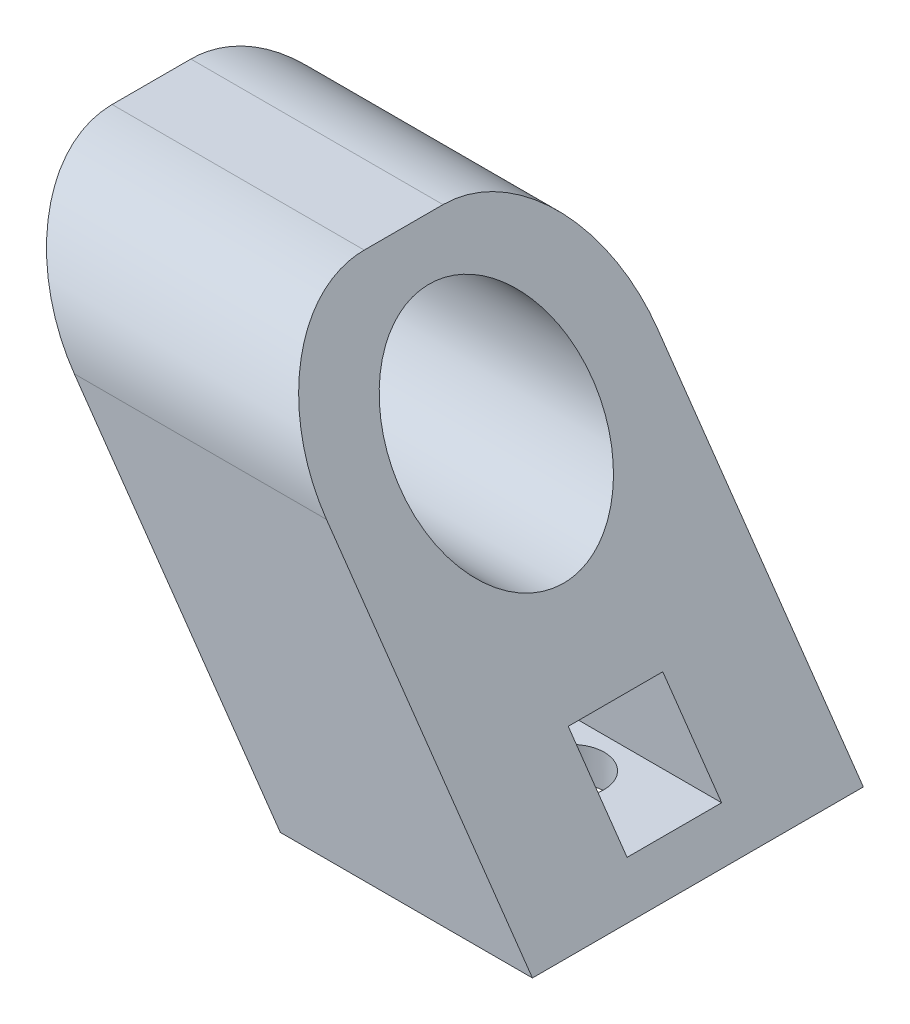
ISO-10303-21;
HEADER;
FILE_DESCRIPTION(('STEP AP214'),'2;1');
FILE_NAME('part.step','',(''),(''),'','','');
FILE_SCHEMA(('AUTOMOTIVE_DESIGN { 1 0 10303 214 1 1 1 1 }'));
ENDSEC;
DATA;
#1=APPLICATION_CONTEXT('core data for automotive mechanical design processes');
#2=APPLICATION_PROTOCOL_DEFINITION('international standard','automotive_design',2000,#1);
#3=PRODUCT_CONTEXT('',#1,'mechanical');
#4=PRODUCT('Part','Part','',(#3));
#5=PRODUCT_RELATED_PRODUCT_CATEGORY('part','',(#4));
#6=PRODUCT_DEFINITION_FORMATION('','',#4);
#7=PRODUCT_DEFINITION_CONTEXT('part definition',#1,'design');
#8=PRODUCT_DEFINITION('design','',#6,#7);
#9=PRODUCT_DEFINITION_SHAPE('','',#8);
#10=(LENGTH_UNIT() NAMED_UNIT(*) SI_UNIT(.MILLI.,.METRE.));
#11=(NAMED_UNIT(*) PLANE_ANGLE_UNIT() SI_UNIT($,.RADIAN.));
#12=(NAMED_UNIT(*) SI_UNIT($,.STERADIAN.) SOLID_ANGLE_UNIT());
#13=UNCERTAINTY_MEASURE_WITH_UNIT(LENGTH_MEASURE(1.E-05),#10,'distance_accuracy_value','');
#14=(GEOMETRIC_REPRESENTATION_CONTEXT(3) GLOBAL_UNCERTAINTY_ASSIGNED_CONTEXT((#13)) GLOBAL_UNIT_ASSIGNED_CONTEXT((#10,
#11,#12)) REPRESENTATION_CONTEXT('',''));
#15=CARTESIAN_POINT('',(0.,0.,0.));
#16=DIRECTION('',(0.,0.,1.));
#17=DIRECTION('',(1.,0.,0.));
#18=AXIS2_PLACEMENT_3D('',#15,#16,#17);
#19=CARTESIAN_POINT('',(9.16381546448805,20.,25.));
#20=DIRECTION('',(0.,-1.,0.));
#21=DIRECTION('',(1.,0.,0.));
#22=AXIS2_PLACEMENT_3D('',#19,#20,#21);
#23=PLANE('',#22);
#24=DIRECTION('',(0.,0.,-1.));
#25=VECTOR('',#24,1.);
#26=CARTESIAN_POINT('',(9.16381546448805,20.,25.));
#27=LINE('',#26,#25);
#28=CARTESIAN_POINT('',(9.16381546448805,20.,5.95));
#29=VERTEX_POINT('',#28);
#30=CARTESIAN_POINT('',(9.16381546448805,20.,-5.95));
#31=VERTEX_POINT('',#30);
#32=EDGE_CURVE('E156',#29,#31,#27,.T.);
#33=ORIENTED_EDGE('',*,*,#32,.T.);
#34=DIRECTION('',(-1.,0.,0.));
#35=VECTOR('',#34,1.);
#36=CARTESIAN_POINT('',(9.16381546448805,20.,-5.95));
#37=LINE('',#36,#35);
#38=CARTESIAN_POINT('',(-28.936184535512,20.,-5.95));
#39=VERTEX_POINT('',#38);
#40=EDGE_CURVE('E175',#31,#39,#37,.T.);
#41=ORIENTED_EDGE('',*,*,#40,.T.);
#42=DIRECTION('',(0.,0.,-1.));
#43=VECTOR('',#42,1.);
#44=CARTESIAN_POINT('',(-28.936184535512,20.,25.));
#45=LINE('',#44,#43);
#46=CARTESIAN_POINT('',(-28.936184535512,20.,5.95));
#47=VERTEX_POINT('',#46);
#48=EDGE_CURVE('E170',#47,#39,#45,.T.);
#49=ORIENTED_EDGE('',*,*,#48,.F.);
#50=DIRECTION('',(-1.,0.,0.));
#51=VECTOR('',#50,1.);
#52=CARTESIAN_POINT('',(9.16381546448805,20.,5.95));
#53=LINE('',#52,#51);
#54=EDGE_CURVE('E173',#47,#29,#53,.F.);
#55=ORIENTED_EDGE('',*,*,#54,.T.);
#56=EDGE_LOOP('',(#33,#41,#49,#55));
#57=FACE_BOUND('',#56,.T.);
#58=ADVANCED_FACE('F33',(#57),#23,.F.);
#59=CARTESIAN_POINT('',(-28.936184535512,20.,25.));
#60=DIRECTION('',(0.819152044288993,0.573576436351045,0.));
#61=DIRECTION('',(-0.573576436351045,0.819152044288993,0.));
#62=AXIS2_PLACEMENT_3D('',#59,#60,#61);
#63=PLANE('',#62);
#64=CARTESIAN_POINT('',(-14.9320337713178,0.,0.));
#65=DIRECTION('',(0.819152044288993,0.573576436351045,0.));
#66=DIRECTION('',(0.573576436351045,-0.819152044288993,0.));
#67=AXIS2_PLACEMENT_3D('',#64,#65,#66);
#68=ELLIPSE('',#67,17.7012315370411,14.5);
#69=CARTESIAN_POINT('',(-4.77902446727705,-14.5,0.));
#70=VERTEX_POINT('',#69);
#71=EDGE_CURVE('E133',#70,#70,#68,.T.);
#72=ORIENTED_EDGE('',*,*,#71,.T.);
#73=EDGE_LOOP('',(#72));
#74=FACE_BOUND('',#73,.T.);
#75=DIRECTION('',(0.,0.,-1.));
#76=VECTOR('',#75,1.);
#77=CARTESIAN_POINT('',(11.9699398466991,-38.42,25.));
#78=LINE('',#77,#76);
#79=CARTESIAN_POINT('',(11.9699398466991,-38.42,7.14375));
#80=VERTEX_POINT('',#79);
#81=CARTESIAN_POINT('',(11.9699398466991,-38.42,-7.14375));
#82=VERTEX_POINT('',#81);
#83=EDGE_CURVE('E141',#80,#82,#78,.T.);
#84=ORIENTED_EDGE('',*,*,#83,.T.);
#85=DIRECTION('',(-0.573576436351045,0.819152044288993,0.));
#86=VECTOR('',#85,1.);
#87=CARTESIAN_POINT('',(-28.936184535512,20.,-7.14374999999998));
#88=LINE('',#87,#86);
#89=CARTESIAN_POINT('',(3.07730411143586,-25.72,-7.14375));
#90=VERTEX_POINT('',#89);
#91=EDGE_CURVE('E134',#82,#90,#88,.T.);
#92=ORIENTED_EDGE('',*,*,#91,.T.);
#93=DIRECTION('',(0.,0.,1.));
#94=VECTOR('',#93,1.);
#95=CARTESIAN_POINT('',(3.07730411143586,-25.72,25.));
#96=LINE('',#95,#94);
#97=CARTESIAN_POINT('',(3.07730411143586,-25.72,7.14375));
#98=VERTEX_POINT('',#97);
#99=EDGE_CURVE('E270',#90,#98,#96,.T.);
#100=ORIENTED_EDGE('',*,*,#99,.T.);
#101=DIRECTION('',(0.573576436351045,-0.819152044288993,0.));
#102=VECTOR('',#101,1.);
#103=CARTESIAN_POINT('',(-28.936184535512,20.,7.14375));
#104=LINE('',#103,#102);
#105=EDGE_CURVE('E121',#98,#80,#104,.T.);
#106=ORIENTED_EDGE('',*,*,#105,.T.);
#107=EDGE_LOOP('',(#84,#92,#100,#106));
#108=FACE_BOUND('',#107,.T.);
#109=ORIENTED_EDGE('',*,*,#48,.T.);
#110=CARTESIAN_POINT('',(-15.597230932617,0.950000000000002,-5.95));
#111=DIRECTION('',(0.819152044288993,0.573576436351045,0.));
#112=DIRECTION('',(-0.573576436351045,0.819152044288993,0.));
#113=AXIS2_PLACEMENT_3D('',#110,#111,#112);
#114=ELLIPSE('',#113,23.2557559159057,19.05);
#115=CARTESIAN_POINT('',(-15.597230932617,0.950000000000006,-25.));
#116=VERTEX_POINT('',#115);
#117=EDGE_CURVE('E180',#39,#116,#114,.F.);
#118=ORIENTED_EDGE('',*,*,#117,.T.);
#119=DIRECTION('',(0.573576436351045,-0.819152044288993,0.));
#120=VECTOR('',#119,1.);
#121=CARTESIAN_POINT('',(-28.936184535512,20.,-25.));
#122=LINE('',#121,#120);
#123=CARTESIAN_POINT('',(15.5269941408045,-43.5,-25.));
#124=VERTEX_POINT('',#123);
#125=EDGE_CURVE('E138',#116,#124,#122,.T.);
#126=ORIENTED_EDGE('',*,*,#125,.T.);
#127=DIRECTION('',(0.,0.,-1.));
#128=VECTOR('',#127,1.);
#129=CARTESIAN_POINT('',(15.5269941408045,-43.5,25.));
#130=LINE('',#129,#128);
#131=CARTESIAN_POINT('',(15.5269941408045,-43.5,25.));
#132=VERTEX_POINT('',#131);
#133=EDGE_CURVE('E167',#132,#124,#130,.T.);
#134=ORIENTED_EDGE('',*,*,#133,.F.);
#135=DIRECTION('',(0.573576436351045,-0.819152044288993,0.));
#136=VECTOR('',#135,1.);
#137=CARTESIAN_POINT('',(-28.936184535512,20.,25.));
#138=LINE('',#137,#136);
#139=CARTESIAN_POINT('',(-15.597230932617,0.950000000000006,25.));
#140=VERTEX_POINT('',#139);
#141=EDGE_CURVE('E148',#140,#132,#138,.T.);
#142=ORIENTED_EDGE('',*,*,#141,.F.);
#143=CARTESIAN_POINT('',(-15.597230932617,0.950000000000002,5.95));
#144=DIRECTION('',(0.819152044288993,0.573576436351045,0.));
#145=DIRECTION('',(0.573576436351045,-0.819152044288993,0.));
#146=AXIS2_PLACEMENT_3D('',#143,#144,#145);
#147=ELLIPSE('',#146,23.2557559159057,19.05);
#148=EDGE_CURVE('E178',#140,#47,#147,.F.);
#149=ORIENTED_EDGE('',*,*,#148,.T.);
#150=EDGE_LOOP('',(#109,#118,#126,#134,#142,#149));
#151=FACE_BOUND('',#150,.T.);
#152=ADVANCED_FACE('F197',(#74,#108,#151),#63,.F.);
#153=CARTESIAN_POINT('',(15.5269941408045,-43.5,25.));
#154=DIRECTION('',(0.,1.,0.));
#155=DIRECTION('',(-1.,0.,0.));
#156=AXIS2_PLACEMENT_3D('',#153,#154,#155);
#157=PLANE('',#156);
#158=CARTESIAN_POINT('',(34.5769941408045,-43.5,0.));
#159=DIRECTION('',(0.,-1.,0.));
#160=DIRECTION('',(1.,0.,0.));
#161=AXIS2_PLACEMENT_3D('',#158,#159,#160);
#162=CIRCLE('',#161,4.8895);
#163=CARTESIAN_POINT('',(39.4664941408045,-43.5,0.));
#164=VERTEX_POINT('',#163);
#165=EDGE_CURVE('E261',#164,#164,#162,.T.);
#166=ORIENTED_EDGE('',*,*,#165,.F.);
#167=EDGE_LOOP('',(#166));
#168=FACE_BOUND('',#167,.T.);
#169=DIRECTION('',(1.,0.,0.));
#170=VECTOR('',#169,1.);
#171=CARTESIAN_POINT('',(15.5269941408045,-43.5,-25.));
#172=LINE('',#171,#170);
#173=CARTESIAN_POINT('',(53.6269941408045,-43.5,-25.));
#174=VERTEX_POINT('',#173);
#175=EDGE_CURVE('E158',#124,#174,#172,.T.);
#176=ORIENTED_EDGE('',*,*,#175,.T.);
#177=DIRECTION('',(0.,0.,-1.));
#178=VECTOR('',#177,1.);
#179=CARTESIAN_POINT('',(53.6269941408045,-43.5,25.));
#180=LINE('',#179,#178);
#181=CARTESIAN_POINT('',(53.6269941408045,-43.5,25.));
#182=VERTEX_POINT('',#181);
#183=EDGE_CURVE('E164',#182,#174,#180,.T.);
#184=ORIENTED_EDGE('',*,*,#183,.F.);
#185=DIRECTION('',(1.,0.,0.));
#186=VECTOR('',#185,1.);
#187=CARTESIAN_POINT('',(15.5269941408045,-43.5,25.));
#188=LINE('',#187,#186);
#189=EDGE_CURVE('E150',#132,#182,#188,.T.);
#190=ORIENTED_EDGE('',*,*,#189,.F.);
#191=ORIENTED_EDGE('',*,*,#133,.T.);
#192=EDGE_LOOP('',(#176,#184,#190,#191));
#193=FACE_BOUND('',#192,.T.);
#194=ADVANCED_FACE('F204',(#168,#193),#157,.F.);
#195=CARTESIAN_POINT('',(53.6269941408045,-43.5,25.));
#196=DIRECTION('',(-0.819152044288993,-0.573576436351045,0.));
#197=DIRECTION('',(0.573576436351045,-0.819152044288993,0.));
#198=AXIS2_PLACEMENT_3D('',#195,#196,#197);
#199=PLANE('',#198);
#200=CARTESIAN_POINT('',(23.1679662286822,0.,0.));
#201=DIRECTION('',(-0.819152044288993,-0.573576436351045,0.));
#202=DIRECTION('',(0.573576436351045,-0.819152044288993,0.));
#203=AXIS2_PLACEMENT_3D('',#200,#201,#202);
#204=ELLIPSE('',#203,17.7012315370411,14.5);
#205=CARTESIAN_POINT('',(33.3209755327229,-14.5,0.));
#206=VERTEX_POINT('',#205);
#207=EDGE_CURVE('E131',#206,#206,#204,.T.);
#208=ORIENTED_EDGE('',*,*,#207,.T.);
#209=EDGE_LOOP('',(#208));
#210=FACE_BOUND('',#209,.T.);
#211=DIRECTION('',(0.,0.,-1.));
#212=VECTOR('',#211,1.);
#213=CARTESIAN_POINT('',(41.1773041114359,-25.72,25.));
#214=LINE('',#213,#212);
#215=CARTESIAN_POINT('',(41.1773041114359,-25.72,7.14375));
#216=VERTEX_POINT('',#215);
#217=CARTESIAN_POINT('',(41.1773041114359,-25.72,-7.14375));
#218=VERTEX_POINT('',#217);
#219=EDGE_CURVE('E109',#216,#218,#214,.T.);
#220=ORIENTED_EDGE('',*,*,#219,.T.);
#221=DIRECTION('',(0.573576436351045,-0.819152044288993,0.));
#222=VECTOR('',#221,1.);
#223=CARTESIAN_POINT('',(53.6269941408044,-43.5,-7.14375));
#224=LINE('',#223,#222);
#225=CARTESIAN_POINT('',(50.0699398466991,-38.42,-7.14375));
#226=VERTEX_POINT('',#225);
#227=EDGE_CURVE('E11',#218,#226,#224,.T.);
#228=ORIENTED_EDGE('',*,*,#227,.T.);
#229=DIRECTION('',(0.,0.,1.));
#230=VECTOR('',#229,1.);
#231=CARTESIAN_POINT('',(50.0699398466991,-38.42,25.));
#232=LINE('',#231,#230);
#233=CARTESIAN_POINT('',(50.0699398466991,-38.42,7.14375));
#234=VERTEX_POINT('',#233);
#235=EDGE_CURVE('E42',#226,#234,#232,.T.);
#236=ORIENTED_EDGE('',*,*,#235,.T.);
#237=DIRECTION('',(-0.573576436351045,0.819152044288993,0.));
#238=VECTOR('',#237,1.);
#239=CARTESIAN_POINT('',(53.6269941408045,-43.5,7.14374999999999));
#240=LINE('',#239,#238);
#241=EDGE_CURVE('E113',#234,#216,#240,.T.);
#242=ORIENTED_EDGE('',*,*,#241,.T.);
#243=EDGE_LOOP('',(#220,#228,#236,#242));
#244=FACE_BOUND('',#243,.T.);
#245=DIRECTION('',(-0.573576436351045,0.819152044288993,0.));
#246=VECTOR('',#245,1.);
#247=CARTESIAN_POINT('',(53.6269941408045,-43.5,-25.));
#248=LINE('',#247,#246);
#249=CARTESIAN_POINT('',(22.502769067383,0.95,-25.));
#250=VERTEX_POINT('',#249);
#251=EDGE_CURVE('E151',#174,#250,#248,.T.);
#252=ORIENTED_EDGE('',*,*,#251,.T.);
#253=CARTESIAN_POINT('',(22.502769067383,0.950000000000009,-5.95));
#254=DIRECTION('',(-0.819152044288993,-0.573576436351045,0.));
#255=DIRECTION('',(-0.573576436351045,0.819152044288993,0.));
#256=AXIS2_PLACEMENT_3D('',#253,#254,#255);
#257=ELLIPSE('',#256,23.2557559159057,19.05);
#258=EDGE_CURVE('E186',#250,#31,#257,.F.);
#259=ORIENTED_EDGE('',*,*,#258,.T.);
#260=ORIENTED_EDGE('',*,*,#32,.F.);
#261=CARTESIAN_POINT('',(22.502769067383,0.950000000000009,5.95));
#262=DIRECTION('',(-0.819152044288993,-0.573576436351045,0.));
#263=DIRECTION('',(0.573576436351045,-0.819152044288993,0.));
#264=AXIS2_PLACEMENT_3D('',#261,#262,#263);
#265=ELLIPSE('',#264,23.2557559159057,19.05);
#266=CARTESIAN_POINT('',(22.502769067383,0.95,25.));
#267=VERTEX_POINT('',#266);
#268=EDGE_CURVE('E184',#29,#267,#265,.F.);
#269=ORIENTED_EDGE('',*,*,#268,.T.);
#270=DIRECTION('',(-0.573576436351045,0.819152044288993,0.));
#271=VECTOR('',#270,1.);
#272=CARTESIAN_POINT('',(53.6269941408045,-43.5,25.));
#273=LINE('',#272,#271);
#274=EDGE_CURVE('E153',#182,#267,#273,.T.);
#275=ORIENTED_EDGE('',*,*,#274,.F.);
#276=ORIENTED_EDGE('',*,*,#183,.T.);
#277=EDGE_LOOP('',(#252,#259,#260,#269,#275,#276));
#278=FACE_BOUND('',#277,.T.);
#279=ADVANCED_FACE('F126',(#210,#244,#278),#199,.F.);
#280=CARTESIAN_POINT('',(0.,0.,25.));
#281=DIRECTION('',(0.,0.,1.));
#282=DIRECTION('',(1.,0.,0.));
#283=AXIS2_PLACEMENT_3D('',#280,#281,#282);
#284=PLANE('',#283);
#285=ORIENTED_EDGE('',*,*,#274,.T.);
#286=DIRECTION('',(-1.,0.,0.));
#287=VECTOR('',#286,1.);
#288=CARTESIAN_POINT('',(-28.9361845355119,0.95,25.));
#289=LINE('',#288,#287);
#290=EDGE_CURVE('E114',#267,#140,#289,.T.);
#291=ORIENTED_EDGE('',*,*,#290,.T.);
#292=ORIENTED_EDGE('',*,*,#141,.T.);
#293=ORIENTED_EDGE('',*,*,#189,.T.);
#294=EDGE_LOOP('',(#285,#291,#292,#293));
#295=FACE_BOUND('',#294,.T.);
#296=ADVANCED_FACE('F191',(#295),#284,.T.);
#297=CARTESIAN_POINT('',(0.,0.,-25.));
#298=DIRECTION('',(0.,0.,1.));
#299=DIRECTION('',(1.,0.,0.));
#300=AXIS2_PLACEMENT_3D('',#297,#298,#299);
#301=PLANE('',#300);
#302=ORIENTED_EDGE('',*,*,#125,.F.);
#303=DIRECTION('',(-1.,0.,0.));
#304=VECTOR('',#303,1.);
#305=CARTESIAN_POINT('',(0.,0.950000000000005,-25.));
#306=LINE('',#305,#304);
#307=EDGE_CURVE('E182',#116,#250,#306,.F.);
#308=ORIENTED_EDGE('',*,*,#307,.T.);
#309=ORIENTED_EDGE('',*,*,#251,.F.);
#310=ORIENTED_EDGE('',*,*,#175,.F.);
#311=EDGE_LOOP('',(#302,#308,#309,#310));
#312=FACE_BOUND('',#311,.T.);
#313=ADVANCED_FACE('F213',(#312),#301,.F.);
#314=CARTESIAN_POINT('',(9.16381546448805,0.950000000000006,-5.95));
#315=DIRECTION('',(-1.,0.,0.));
#316=DIRECTION('',(0.,-1.,0.));
#317=AXIS2_PLACEMENT_3D('',#314,#315,#316);
#318=CYLINDRICAL_SURFACE('',#317,19.05);
#319=ORIENTED_EDGE('',*,*,#258,.F.);
#320=ORIENTED_EDGE('',*,*,#307,.F.);
#321=ORIENTED_EDGE('',*,*,#117,.F.);
#322=ORIENTED_EDGE('',*,*,#40,.F.);
#323=EDGE_LOOP('',(#319,#320,#321,#322));
#324=FACE_BOUND('',#323,.T.);
#325=ADVANCED_FACE('F215',(#324),#318,.T.);
#326=CARTESIAN_POINT('',(0.,0.950000000000005,5.95));
#327=DIRECTION('',(1.,0.,0.));
#328=DIRECTION('',(0.,1.,0.));
#329=AXIS2_PLACEMENT_3D('',#326,#327,#328);
#330=CYLINDRICAL_SURFACE('',#329,19.05);
#331=ORIENTED_EDGE('',*,*,#268,.F.);
#332=ORIENTED_EDGE('',*,*,#54,.F.);
#333=ORIENTED_EDGE('',*,*,#148,.F.);
#334=ORIENTED_EDGE('',*,*,#290,.F.);
#335=EDGE_LOOP('',(#331,#332,#333,#334));
#336=FACE_BOUND('',#335,.T.);
#337=ADVANCED_FACE('F35',(#336),#330,.T.);
#338=CARTESIAN_POINT('',(-28.936184535512,-25.72,-7.14375));
#339=DIRECTION('',(0.,0.,-1.));
#340=DIRECTION('',(0.,1.,0.));
#341=AXIS2_PLACEMENT_3D('',#338,#339,#340);
#342=PLANE('',#341);
#343=DIRECTION('',(1.,0.,0.));
#344=VECTOR('',#343,1.);
#345=CARTESIAN_POINT('',(-28.936184535512,-38.42,-7.14375));
#346=LINE('',#345,#344);
#347=EDGE_CURVE('E267',#82,#226,#346,.T.);
#348=ORIENTED_EDGE('',*,*,#347,.T.);
#349=ORIENTED_EDGE('',*,*,#227,.F.);
#350=DIRECTION('',(1.,0.,0.));
#351=VECTOR('',#350,1.);
#352=CARTESIAN_POINT('',(-28.936184535512,-25.72,-7.14375));
#353=LINE('',#352,#351);
#354=EDGE_CURVE('E55',#90,#218,#353,.T.);
#355=ORIENTED_EDGE('',*,*,#354,.F.);
#356=ORIENTED_EDGE('',*,*,#91,.F.);
#357=EDGE_LOOP('',(#348,#349,#355,#356));
#358=FACE_BOUND('',#357,.T.);
#359=ADVANCED_FACE('F221',(#358),#342,.F.);
#360=CARTESIAN_POINT('',(-28.936184535512,-38.42,7.14375));
#361=DIRECTION('',(0.,-1.,0.));
#362=DIRECTION('',(0.,0.,-1.));
#363=AXIS2_PLACEMENT_3D('',#360,#361,#362);
#364=PLANE('',#363);
#365=CARTESIAN_POINT('',(34.5769941408045,-38.42,0.));
#366=DIRECTION('',(0.,-1.,0.));
#367=DIRECTION('',(0.,0.,-1.));
#368=AXIS2_PLACEMENT_3D('',#365,#366,#367);
#369=CIRCLE('',#368,4.8895);
#370=CARTESIAN_POINT('',(34.5769941408045,-38.42,-4.8895));
#371=VERTEX_POINT('',#370);
#372=EDGE_CURVE('E37',#371,#371,#369,.T.);
#373=ORIENTED_EDGE('',*,*,#372,.T.);
#374=EDGE_LOOP('',(#373));
#375=FACE_BOUND('',#374,.T.);
#376=DIRECTION('',(1.,0.,0.));
#377=VECTOR('',#376,1.);
#378=CARTESIAN_POINT('',(-28.936184535512,-38.42,7.14375));
#379=LINE('',#378,#377);
#380=EDGE_CURVE('E123',#80,#234,#379,.T.);
#381=ORIENTED_EDGE('',*,*,#380,.T.);
#382=ORIENTED_EDGE('',*,*,#235,.F.);
#383=ORIENTED_EDGE('',*,*,#347,.F.);
#384=ORIENTED_EDGE('',*,*,#83,.F.);
#385=EDGE_LOOP('',(#381,#382,#383,#384));
#386=FACE_BOUND('',#385,.T.);
#387=ADVANCED_FACE('F240',(#375,#386),#364,.F.);
#388=CARTESIAN_POINT('',(-28.936184535512,-25.72,7.14375));
#389=DIRECTION('',(0.,0.,1.));
#390=DIRECTION('',(0.,-1.,0.));
#391=AXIS2_PLACEMENT_3D('',#388,#389,#390);
#392=PLANE('',#391);
#393=DIRECTION('',(1.,0.,0.));
#394=VECTOR('',#393,1.);
#395=CARTESIAN_POINT('',(-28.936184535512,-25.72,7.14375));
#396=LINE('',#395,#394);
#397=EDGE_CURVE('E50',#98,#216,#396,.T.);
#398=ORIENTED_EDGE('',*,*,#397,.T.);
#399=ORIENTED_EDGE('',*,*,#241,.F.);
#400=ORIENTED_EDGE('',*,*,#380,.F.);
#401=ORIENTED_EDGE('',*,*,#105,.F.);
#402=EDGE_LOOP('',(#398,#399,#400,#401));
#403=FACE_BOUND('',#402,.T.);
#404=ADVANCED_FACE('F117',(#403),#392,.F.);
#405=CARTESIAN_POINT('',(-28.936184535512,-25.72,7.14375));
#406=DIRECTION('',(0.,1.,0.));
#407=DIRECTION('',(0.,0.,1.));
#408=AXIS2_PLACEMENT_3D('',#405,#406,#407);
#409=PLANE('',#408);
#410=ORIENTED_EDGE('',*,*,#354,.T.);
#411=ORIENTED_EDGE('',*,*,#219,.F.);
#412=ORIENTED_EDGE('',*,*,#397,.F.);
#413=ORIENTED_EDGE('',*,*,#99,.F.);
#414=EDGE_LOOP('',(#410,#411,#412,#413));
#415=FACE_BOUND('',#414,.T.);
#416=ADVANCED_FACE('F110',(#415),#409,.F.);
#417=CARTESIAN_POINT('',(-28.936184535512,0.,0.));
#418=DIRECTION('',(1.,0.,0.));
#419=DIRECTION('',(0.,0.,-1.));
#420=AXIS2_PLACEMENT_3D('',#417,#418,#419);
#421=CYLINDRICAL_SURFACE('',#420,14.5);
#422=ORIENTED_EDGE('',*,*,#207,.F.);
#423=EDGE_LOOP('',(#422));
#424=FACE_BOUND('',#423,.T.);
#425=ORIENTED_EDGE('',*,*,#71,.F.);
#426=EDGE_LOOP('',(#425));
#427=FACE_BOUND('',#426,.T.);
#428=ADVANCED_FACE('F244',(#424,#427),#421,.F.);
#429=CARTESIAN_POINT('',(34.5769941408045,-30.8,0.));
#430=DIRECTION('',(0.,-1.,0.));
#431=DIRECTION('',(1.,0.,0.));
#432=AXIS2_PLACEMENT_3D('',#429,#430,#431);
#433=CYLINDRICAL_SURFACE('',#432,4.8895);
#434=ORIENTED_EDGE('',*,*,#165,.T.);
#435=EDGE_LOOP('',(#434));
#436=FACE_BOUND('',#435,.T.);
#437=ORIENTED_EDGE('',*,*,#372,.F.);
#438=EDGE_LOOP('',(#437));
#439=FACE_BOUND('',#438,.T.);
#440=ADVANCED_FACE('F252',(#436,#439),#433,.F.);
#441=CLOSED_SHELL('',(#58,#152,#194,#279,#296,#313,#325,#337,#359,#387,#404,#416,#428,#440));
#442=MANIFOLD_SOLID_BREP('B2',#441);
#443=ADVANCED_BREP_SHAPE_REPRESENTATION('',(#18,#442),#14);
#444=SHAPE_DEFINITION_REPRESENTATION(#9,#443);
ENDSEC;
END-ISO-10303-21;
